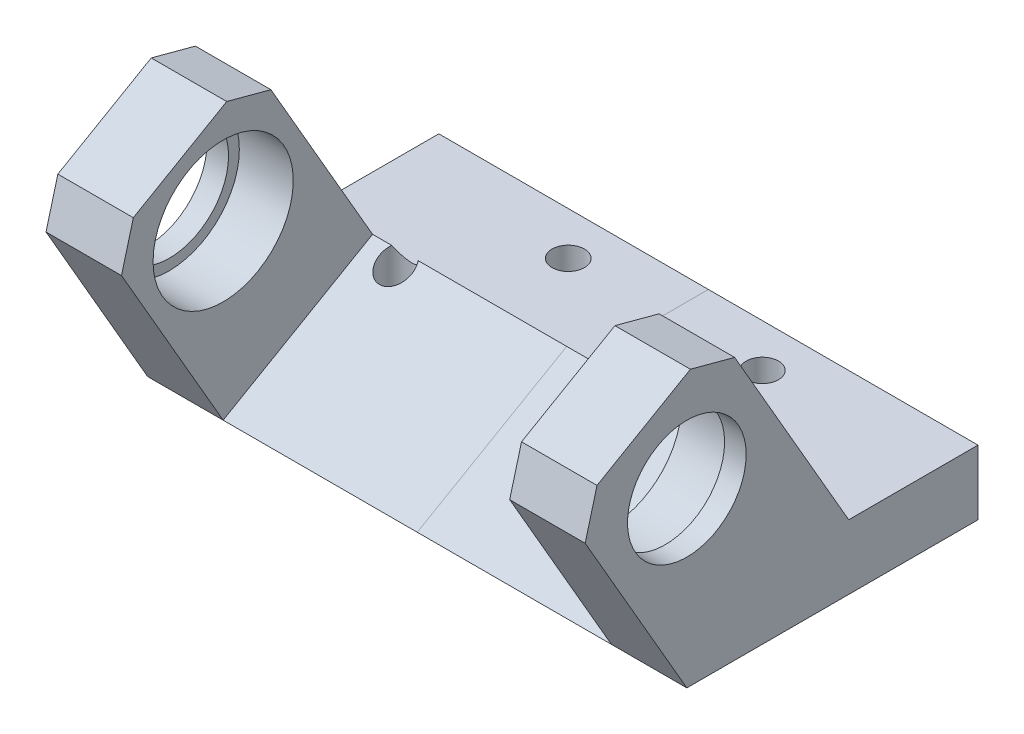
ISO-10303-21;
HEADER;
FILE_DESCRIPTION(('STEP AP214'),'2;1');
FILE_NAME('part.step','',(''),(''),'','','');
FILE_SCHEMA(('AUTOMOTIVE_DESIGN { 1 0 10303 214 1 1 1 1 }'));
ENDSEC;
DATA;
#1=APPLICATION_CONTEXT('core data for automotive mechanical design processes');
#2=APPLICATION_PROTOCOL_DEFINITION('international standard','automotive_design',2000,#1);
#3=PRODUCT_CONTEXT('',#1,'mechanical');
#4=PRODUCT('Part','Part','',(#3));
#5=PRODUCT_RELATED_PRODUCT_CATEGORY('part','',(#4));
#6=PRODUCT_DEFINITION_FORMATION('','',#4);
#7=PRODUCT_DEFINITION_CONTEXT('part definition',#1,'design');
#8=PRODUCT_DEFINITION('design','',#6,#7);
#9=PRODUCT_DEFINITION_SHAPE('','',#8);
#10=(LENGTH_UNIT() NAMED_UNIT(*) SI_UNIT(.MILLI.,.METRE.));
#11=(NAMED_UNIT(*) PLANE_ANGLE_UNIT() SI_UNIT($,.RADIAN.));
#12=(NAMED_UNIT(*) SI_UNIT($,.STERADIAN.) SOLID_ANGLE_UNIT());
#13=UNCERTAINTY_MEASURE_WITH_UNIT(LENGTH_MEASURE(1.E-05),#10,'distance_accuracy_value','');
#14=(GEOMETRIC_REPRESENTATION_CONTEXT(3) GLOBAL_UNCERTAINTY_ASSIGNED_CONTEXT((#13)) GLOBAL_UNIT_ASSIGNED_CONTEXT((#10,
#11,#12)) REPRESENTATION_CONTEXT('',''));
#15=CARTESIAN_POINT('',(0.,0.,0.));
#16=DIRECTION('',(0.,0.,1.));
#17=DIRECTION('',(1.,0.,0.));
#18=AXIS2_PLACEMENT_3D('',#15,#16,#17);
#19=CARTESIAN_POINT('',(0.,0.,0.));
#20=DIRECTION('',(1.,0.,0.));
#21=DIRECTION('',(0.,0.,-1.));
#22=AXIS2_PLACEMENT_3D('',#19,#20,#21);
#23=PLANE('',#22);
#24=DIRECTION('',(0.,0.499999999999999,-0.866025403784439));
#25=VECTOR('',#24,1.);
#26=CARTESIAN_POINT('',(0.,0.,0.));
#27=LINE('',#26,#25);
#28=CARTESIAN_POINT('',(0.,0.,0.));
#29=VERTEX_POINT('',#28);
#30=CARTESIAN_POINT('',(0.,7.99999999999997,-13.856406460551));
#31=VERTEX_POINT('',#30);
#32=EDGE_CURVE('E225',#29,#31,#27,.T.);
#33=ORIENTED_EDGE('',*,*,#32,.F.);
#34=DIRECTION('',(0.,0.,-1.));
#35=VECTOR('',#34,1.);
#36=CARTESIAN_POINT('',(0.,0.,-27.));
#37=LINE('',#36,#35);
#38=CARTESIAN_POINT('',(0.,0.,-27.));
#39=VERTEX_POINT('',#38);
#40=EDGE_CURVE('E227',#29,#39,#37,.T.);
#41=ORIENTED_EDGE('',*,*,#40,.T.);
#42=DIRECTION('',(0.,1.,0.));
#43=VECTOR('',#42,1.);
#44=CARTESIAN_POINT('',(0.,6.,-27.));
#45=LINE('',#44,#43);
#46=CARTESIAN_POINT('',(0.,6.,-27.));
#47=VERTEX_POINT('',#46);
#48=EDGE_CURVE('E167',#39,#47,#45,.T.);
#49=ORIENTED_EDGE('',*,*,#48,.T.);
#50=DIRECTION('',(0.,0.,1.));
#51=VECTOR('',#50,1.);
#52=CARTESIAN_POINT('',(0.,6.,-15.0111069989303));
#53=LINE('',#52,#51);
#54=CARTESIAN_POINT('',(0.,6.,-15.0111069989303));
#55=VERTEX_POINT('',#54);
#56=EDGE_CURVE('E150',#47,#55,#53,.T.);
#57=ORIENTED_EDGE('',*,*,#56,.T.);
#58=DIRECTION('',(0.,0.86602540378444,0.499999999999998));
#59=VECTOR('',#58,1.);
#60=CARTESIAN_POINT('',(0.,26.9282032302755,-2.92820323027557));
#61=LINE('',#60,#59);
#62=EDGE_CURVE('E163',#55,#31,#61,.T.);
#63=ORIENTED_EDGE('',*,*,#62,.T.);
#64=EDGE_LOOP('',(#33,#41,#49,#57,#63));
#65=FACE_BOUND('',#64,.T.);
#66=ADVANCED_FACE('F63',(#65),#23,.T.);
#67=CARTESIAN_POINT('',(-23.,16.,0.));
#68=DIRECTION('',(-1.,0.,0.));
#69=DIRECTION('',(0.,0.,-1.));
#70=AXIS2_PLACEMENT_3D('',#67,#68,#69);
#71=PLANE('',#70);
#72=CARTESIAN_POINT('',(-23.,16.,0.));
#73=DIRECTION('',(1.,0.,0.));
#74=DIRECTION('',(0.,0.,-1.));
#75=AXIS2_PLACEMENT_3D('',#72,#73,#74);
#76=CIRCLE('',#75,6.5);
#77=CARTESIAN_POINT('',(-23.,16.,-6.50000000000004));
#78=VERTEX_POINT('',#77);
#79=EDGE_CURVE('E208',#78,#78,#76,.T.);
#80=ORIENTED_EDGE('',*,*,#79,.T.);
#81=EDGE_LOOP('',(#80));
#82=FACE_BOUND('',#81,.T.);
#83=CARTESIAN_POINT('',(-23.,16.,0.));
#84=DIRECTION('',(1.,0.,0.));
#85=DIRECTION('',(0.,0.,-1.));
#86=AXIS2_PLACEMENT_3D('',#83,#84,#85);
#87=CIRCLE('',#86,5.5);
#88=CARTESIAN_POINT('',(-23.,16.,-5.50000000000004));
#89=VERTEX_POINT('',#88);
#90=EDGE_CURVE('E212',#89,#89,#87,.T.);
#91=ORIENTED_EDGE('',*,*,#90,.F.);
#92=EDGE_LOOP('',(#91));
#93=FACE_BOUND('',#92,.T.);
#94=ADVANCED_FACE('F300',(#82,#93),#71,.F.);
#95=CARTESIAN_POINT('',(-23.,16.,0.));
#96=DIRECTION('',(-1.,0.,0.));
#97=DIRECTION('',(0.,0.,1.));
#98=AXIS2_PLACEMENT_3D('',#95,#96,#97);
#99=CYLINDRICAL_SURFACE('',#98,5.5);
#100=ORIENTED_EDGE('',*,*,#90,.T.);
#101=EDGE_LOOP('',(#100));
#102=FACE_BOUND('',#101,.T.);
#103=CARTESIAN_POINT('',(-25.,16.,0.));
#104=DIRECTION('',(1.,0.,0.));
#105=DIRECTION('',(0.,0.,-1.));
#106=AXIS2_PLACEMENT_3D('',#103,#104,#105);
#107=CIRCLE('',#106,5.5);
#108=CARTESIAN_POINT('',(-25.,16.,-5.50000000000004));
#109=VERTEX_POINT('',#108);
#110=EDGE_CURVE('E213',#109,#109,#107,.T.);
#111=ORIENTED_EDGE('',*,*,#110,.F.);
#112=EDGE_LOOP('',(#111));
#113=FACE_BOUND('',#112,.T.);
#114=ADVANCED_FACE('F302',(#102,#113),#99,.F.);
#115=CARTESIAN_POINT('',(25.,18.9282032302755,10.9282032302755));
#116=DIRECTION('',(0.,-0.86602540378444,-0.499999999999998));
#117=DIRECTION('',(0.,0.499999999999998,-0.86602540378444));
#118=AXIS2_PLACEMENT_3D('',#115,#116,#117);
#119=PLANE('',#118);
#120=DIRECTION('',(1.,0.,0.));
#121=VECTOR('',#120,1.);
#122=CARTESIAN_POINT('',(25.,20.4282032302755,8.33012701892215));
#123=LINE('',#122,#121);
#124=CARTESIAN_POINT('',(-25.,20.4282032302755,8.33012701892215));
#125=VERTEX_POINT('',#124);
#126=CARTESIAN_POINT('',(-18.,20.4282032302755,8.33012701892215));
#127=VERTEX_POINT('',#126);
#128=EDGE_CURVE('E176',#125,#127,#123,.T.);
#129=ORIENTED_EDGE('',*,*,#128,.T.);
#130=DIRECTION('',(0.,-0.499999999999999,0.866025403784439));
#131=VECTOR('',#130,1.);
#132=CARTESIAN_POINT('',(-18.,26.9282032302755,-2.92820323027556));
#133=LINE('',#132,#131);
#134=CARTESIAN_POINT('',(-18.,25.4282032302755,-0.330127018922256));
#135=VERTEX_POINT('',#134);
#136=EDGE_CURVE('E207',#135,#127,#133,.T.);
#137=ORIENTED_EDGE('',*,*,#136,.F.);
#138=DIRECTION('',(-1.,0.,0.));
#139=VECTOR('',#138,1.);
#140=CARTESIAN_POINT('',(25.,25.4282032302755,-0.330127018922264));
#141=LINE('',#140,#139);
#142=CARTESIAN_POINT('',(-25.,25.4282032302755,-0.33012701892226));
#143=VERTEX_POINT('',#142);
#144=EDGE_CURVE('E180',#135,#143,#141,.T.);
#145=ORIENTED_EDGE('',*,*,#144,.T.);
#146=DIRECTION('',(0.,-0.499999999999998,0.86602540378444));
#147=VECTOR('',#146,1.);
#148=CARTESIAN_POINT('',(-25.,18.9282032302755,10.9282032302755));
#149=LINE('',#148,#147);
#150=EDGE_CURVE('E245',#143,#125,#149,.T.);
#151=ORIENTED_EDGE('',*,*,#150,.T.);
#152=EDGE_LOOP('',(#129,#137,#145,#151));
#153=FACE_BOUND('',#152,.T.);
#154=ADVANCED_FACE('F309',(#153),#119,.F.);
#155=CARTESIAN_POINT('',(25.,16.3301270189222,9.42820323027548));
#156=DIRECTION('',(0.,-0.258819045102525,-0.965925826289067));
#157=DIRECTION('',(-1.,0.,0.));
#158=AXIS2_PLACEMENT_3D('',#155,#156,#157);
#159=PLANE('',#158);
#160=DIRECTION('',(0.,0.965925826289067,-0.258819045102525));
#161=VECTOR('',#160,1.);
#162=CARTESIAN_POINT('',(-18.,16.3301270189222,9.42820323027548));
#163=LINE('',#162,#161);
#164=CARTESIAN_POINT('',(-18.,16.3301270189222,9.42820323027548));
#165=VERTEX_POINT('',#164);
#166=EDGE_CURVE('E202',#127,#165,#163,.F.);
#167=ORIENTED_EDGE('',*,*,#166,.F.);
#168=ORIENTED_EDGE('',*,*,#128,.F.);
#169=DIRECTION('',(0.,-0.965925826289067,0.258819045102525));
#170=VECTOR('',#169,1.);
#171=CARTESIAN_POINT('',(-25.,16.3301270189222,9.42820323027548));
#172=LINE('',#171,#170);
#173=CARTESIAN_POINT('',(-25.,16.3301270189222,9.42820323027548));
#174=VERTEX_POINT('',#173);
#175=EDGE_CURVE('E182',#174,#125,#172,.F.);
#176=ORIENTED_EDGE('',*,*,#175,.F.);
#177=DIRECTION('',(-1.,0.,0.));
#178=VECTOR('',#177,1.);
#179=CARTESIAN_POINT('',(25.,16.3301270189222,9.42820323027548));
#180=LINE('',#179,#178);
#181=EDGE_CURVE('E183',#165,#174,#180,.T.);
#182=ORIENTED_EDGE('',*,*,#181,.F.);
#183=EDGE_LOOP('',(#167,#168,#176,#182));
#184=FACE_BOUND('',#183,.T.);
#185=ADVANCED_FACE('F264',(#184),#159,.F.);
#186=CARTESIAN_POINT('',(25.,16.,0.));
#187=DIRECTION('',(-1.,0.,0.));
#188=DIRECTION('',(0.,0.,1.));
#189=AXIS2_PLACEMENT_3D('',#186,#187,#188);
#190=CYLINDRICAL_SURFACE('',#189,6.5);
#191=CARTESIAN_POINT('',(-18.,16.,0.));
#192=DIRECTION('',(-1.,0.,0.));
#193=DIRECTION('',(0.,0.,1.));
#194=AXIS2_PLACEMENT_3D('',#191,#192,#193);
#195=CIRCLE('',#194,6.5);
#196=CARTESIAN_POINT('',(-18.,16.,6.49999999999997));
#197=VERTEX_POINT('',#196);
#198=EDGE_CURVE('E249',#197,#197,#195,.T.);
#199=ORIENTED_EDGE('',*,*,#198,.F.);
#200=EDGE_LOOP('',(#199));
#201=FACE_BOUND('',#200,.T.);
#202=ORIENTED_EDGE('',*,*,#79,.F.);
#203=EDGE_LOOP('',(#202));
#204=FACE_BOUND('',#203,.T.);
#205=ADVANCED_FACE('F315',(#201,#204),#190,.F.);
#206=CARTESIAN_POINT('',(25.,0.,0.));
#207=DIRECTION('',(0.,0.499999999999998,-0.86602540378444));
#208=DIRECTION('',(0.,0.86602540378444,0.499999999999998));
#209=AXIS2_PLACEMENT_3D('',#206,#207,#208);
#210=PLANE('',#209);
#211=DIRECTION('',(-1.,0.,0.));
#212=VECTOR('',#211,1.);
#213=CARTESIAN_POINT('',(25.,0.,0.));
#214=LINE('',#213,#212);
#215=CARTESIAN_POINT('',(-18.,0.,0.));
#216=VERTEX_POINT('',#215);
#217=CARTESIAN_POINT('',(-25.,0.,0.));
#218=VERTEX_POINT('',#217);
#219=EDGE_CURVE('E157',#216,#218,#214,.T.);
#220=ORIENTED_EDGE('',*,*,#219,.F.);
#221=DIRECTION('',(0.,0.86602540378444,0.499999999999998));
#222=VECTOR('',#221,1.);
#223=CARTESIAN_POINT('',(-18.,0.,0.));
#224=LINE('',#223,#222);
#225=EDGE_CURVE('E196',#216,#165,#224,.T.);
#226=ORIENTED_EDGE('',*,*,#225,.T.);
#227=ORIENTED_EDGE('',*,*,#181,.T.);
#228=DIRECTION('',(0.,-0.86602540378444,-0.499999999999998));
#229=VECTOR('',#228,1.);
#230=CARTESIAN_POINT('',(-25.,0.,0.));
#231=LINE('',#230,#229);
#232=EDGE_CURVE('E189',#174,#218,#231,.T.);
#233=ORIENTED_EDGE('',*,*,#232,.T.);
#234=EDGE_LOOP('',(#220,#226,#227,#233));
#235=FACE_BOUND('',#234,.T.);
#236=ADVANCED_FACE('F261',(#235),#210,.F.);
#237=CARTESIAN_POINT('',(25.,6.,-27.));
#238=DIRECTION('',(0.,0.,1.));
#239=DIRECTION('',(1.,0.,0.));
#240=AXIS2_PLACEMENT_3D('',#237,#238,#239);
#241=PLANE('',#240);
#242=ORIENTED_EDGE('',*,*,#48,.F.);
#243=DIRECTION('',(-1.,0.,0.));
#244=VECTOR('',#243,1.);
#245=CARTESIAN_POINT('',(25.,0.,-27.));
#246=LINE('',#245,#244);
#247=CARTESIAN_POINT('',(-25.,0.,-27.));
#248=VERTEX_POINT('',#247);
#249=EDGE_CURVE('E185',#39,#248,#246,.T.);
#250=ORIENTED_EDGE('',*,*,#249,.T.);
#251=DIRECTION('',(0.,1.,0.));
#252=VECTOR('',#251,1.);
#253=CARTESIAN_POINT('',(-25.,6.,-27.));
#254=LINE('',#253,#252);
#255=CARTESIAN_POINT('',(-25.,6.,-27.));
#256=VERTEX_POINT('',#255);
#257=EDGE_CURVE('E234',#248,#256,#254,.T.);
#258=ORIENTED_EDGE('',*,*,#257,.T.);
#259=DIRECTION('',(-1.,0.,0.));
#260=VECTOR('',#259,1.);
#261=CARTESIAN_POINT('',(25.,6.,-27.));
#262=LINE('',#261,#260);
#263=EDGE_CURVE('E158',#47,#256,#262,.T.);
#264=ORIENTED_EDGE('',*,*,#263,.F.);
#265=EDGE_LOOP('',(#242,#250,#258,#264));
#266=FACE_BOUND('',#265,.T.);
#267=ADVANCED_FACE('F231',(#266),#241,.F.);
#268=CARTESIAN_POINT('',(-9.,0.,-23.));
#269=DIRECTION('',(0.,-1.,0.));
#270=DIRECTION('',(0.,0.,-1.));
#271=AXIS2_PLACEMENT_3D('',#268,#269,#270);
#272=CYLINDRICAL_SURFACE('',#271,1.49999999999999);
#273=CARTESIAN_POINT('',(-9.,0.,-23.));
#274=DIRECTION('',(0.,-1.,0.));
#275=DIRECTION('',(0.,0.,-1.));
#276=AXIS2_PLACEMENT_3D('',#273,#274,#275);
#277=CIRCLE('',#276,1.49999999999999);
#278=CARTESIAN_POINT('',(-9.,0.,-24.5));
#279=VERTEX_POINT('',#278);
#280=EDGE_CURVE('E15',#279,#279,#277,.T.);
#281=ORIENTED_EDGE('',*,*,#280,.T.);
#282=EDGE_LOOP('',(#281));
#283=FACE_BOUND('',#282,.T.);
#284=CARTESIAN_POINT('',(-9.,6.,-23.));
#285=DIRECTION('',(0.,-1.,0.));
#286=DIRECTION('',(0.,0.,-1.));
#287=AXIS2_PLACEMENT_3D('',#284,#285,#286);
#288=CIRCLE('',#287,1.49999999999999);
#289=CARTESIAN_POINT('',(-9.,6.,-24.5));
#290=VERTEX_POINT('',#289);
#291=EDGE_CURVE('E72',#290,#290,#288,.T.);
#292=ORIENTED_EDGE('',*,*,#291,.F.);
#293=EDGE_LOOP('',(#292));
#294=FACE_BOUND('',#293,.T.);
#295=ADVANCED_FACE('F284',(#283,#294),#272,.F.);
#296=CARTESIAN_POINT('',(25.,25.4282032302755,-0.330127018922264));
#297=DIRECTION('',(0.,-0.965925826289067,0.258819045102525));
#298=DIRECTION('',(-1.,0.,0.));
#299=AXIS2_PLACEMENT_3D('',#296,#297,#298);
#300=PLANE('',#299);
#301=DIRECTION('',(0.,-0.258819045102525,-0.965925826289067));
#302=VECTOR('',#301,1.);
#303=CARTESIAN_POINT('',(-18.,25.4282032302755,-0.330127018922264));
#304=LINE('',#303,#302);
#305=CARTESIAN_POINT('',(-18.,24.3301270189222,-4.42820323027556));
#306=VERTEX_POINT('',#305);
#307=EDGE_CURVE('E177',#306,#135,#304,.F.);
#308=ORIENTED_EDGE('',*,*,#307,.F.);
#309=DIRECTION('',(1.,0.,0.));
#310=VECTOR('',#309,1.);
#311=CARTESIAN_POINT('',(25.,24.3301270189222,-4.42820323027556));
#312=LINE('',#311,#310);
#313=CARTESIAN_POINT('',(-25.,24.3301270189222,-4.42820323027556));
#314=VERTEX_POINT('',#313);
#315=EDGE_CURVE('E173',#314,#306,#312,.T.);
#316=ORIENTED_EDGE('',*,*,#315,.F.);
#317=DIRECTION('',(0.,0.258819045102525,0.965925826289067));
#318=VECTOR('',#317,1.);
#319=CARTESIAN_POINT('',(-25.,25.4282032302755,-0.330127018922264));
#320=LINE('',#319,#318);
#321=EDGE_CURVE('E186',#143,#314,#320,.F.);
#322=ORIENTED_EDGE('',*,*,#321,.F.);
#323=ORIENTED_EDGE('',*,*,#144,.F.);
#324=EDGE_LOOP('',(#308,#316,#322,#323));
#325=FACE_BOUND('',#324,.T.);
#326=ADVANCED_FACE('F287',(#325),#300,.F.);
#327=CARTESIAN_POINT('',(-25.,0.,0.));
#328=DIRECTION('',(1.,0.,0.));
#329=DIRECTION('',(0.,0.,-1.));
#330=AXIS2_PLACEMENT_3D('',#327,#328,#329);
#331=PLANE('',#330);
#332=ORIENTED_EDGE('',*,*,#232,.F.);
#333=ORIENTED_EDGE('',*,*,#175,.T.);
#334=ORIENTED_EDGE('',*,*,#150,.F.);
#335=ORIENTED_EDGE('',*,*,#321,.T.);
#336=DIRECTION('',(0.,0.86602540378444,0.499999999999998));
#337=VECTOR('',#336,1.);
#338=CARTESIAN_POINT('',(-25.,26.9282032302755,-2.92820323027557));
#339=LINE('',#338,#337);
#340=CARTESIAN_POINT('',(-25.,6.,-15.0111069989303));
#341=VERTEX_POINT('',#340);
#342=EDGE_CURVE('E243',#341,#314,#339,.T.);
#343=ORIENTED_EDGE('',*,*,#342,.F.);
#344=DIRECTION('',(0.,0.,1.));
#345=VECTOR('',#344,1.);
#346=CARTESIAN_POINT('',(-25.,6.,-15.0111069989303));
#347=LINE('',#346,#345);
#348=EDGE_CURVE('E152',#256,#341,#347,.T.);
#349=ORIENTED_EDGE('',*,*,#348,.F.);
#350=ORIENTED_EDGE('',*,*,#257,.F.);
#351=DIRECTION('',(0.,0.,-1.));
#352=VECTOR('',#351,1.);
#353=CARTESIAN_POINT('',(-25.,0.,-27.));
#354=LINE('',#353,#352);
#355=EDGE_CURVE('E238',#218,#248,#354,.T.);
#356=ORIENTED_EDGE('',*,*,#355,.F.);
#357=EDGE_LOOP('',(#332,#333,#334,#335,#343,#349,#350,#356));
#358=FACE_BOUND('',#357,.T.);
#359=ORIENTED_EDGE('',*,*,#110,.T.);
#360=EDGE_LOOP('',(#359));
#361=FACE_BOUND('',#360,.T.);
#362=ADVANCED_FACE('F241',(#358,#361),#331,.F.);
#363=CARTESIAN_POINT('',(25.,6.,-15.0111069989303));
#364=DIRECTION('',(0.,-1.,0.));
#365=DIRECTION('',(0.,0.,-1.));
#366=AXIS2_PLACEMENT_3D('',#363,#364,#365);
#367=PLANE('',#366);
#368=ORIENTED_EDGE('',*,*,#291,.T.);
#369=EDGE_LOOP('',(#368));
#370=FACE_BOUND('',#369,.T.);
#371=ORIENTED_EDGE('',*,*,#56,.F.);
#372=ORIENTED_EDGE('',*,*,#263,.T.);
#373=ORIENTED_EDGE('',*,*,#348,.T.);
#374=DIRECTION('',(-1.,0.,0.));
#375=VECTOR('',#374,1.);
#376=CARTESIAN_POINT('',(25.,6.,-15.0111069989303));
#377=LINE('',#376,#375);
#378=EDGE_CURVE('E147',#55,#341,#377,.T.);
#379=ORIENTED_EDGE('',*,*,#378,.F.);
#380=EDGE_LOOP('',(#371,#372,#373,#379));
#381=FACE_BOUND('',#380,.T.);
#382=ADVANCED_FACE('F149',(#370,#381),#367,.F.);
#383=CARTESIAN_POINT('',(-18.,7.99999999999997,-13.856406460551));
#384=DIRECTION('',(-1.,0.,0.));
#385=DIRECTION('',(0.,0.,1.));
#386=AXIS2_PLACEMENT_3D('',#383,#384,#385);
#387=PLANE('',#386);
#388=ORIENTED_EDGE('',*,*,#198,.T.);
#389=EDGE_LOOP('',(#388));
#390=FACE_BOUND('',#389,.T.);
#391=ORIENTED_EDGE('',*,*,#166,.T.);
#392=ORIENTED_EDGE('',*,*,#225,.F.);
#393=DIRECTION('',(0.,-0.499999999999999,0.866025403784439));
#394=VECTOR('',#393,1.);
#395=CARTESIAN_POINT('',(-18.,7.99999999999997,-13.856406460551));
#396=LINE('',#395,#394);
#397=CARTESIAN_POINT('',(-18.,7.99999999999997,-13.856406460551));
#398=VERTEX_POINT('',#397);
#399=EDGE_CURVE('E192',#398,#216,#396,.T.);
#400=ORIENTED_EDGE('',*,*,#399,.F.);
#401=DIRECTION('',(0.,0.86602540378444,0.499999999999998));
#402=VECTOR('',#401,1.);
#403=CARTESIAN_POINT('',(-18.,7.99999999999997,-13.856406460551));
#404=LINE('',#403,#402);
#405=EDGE_CURVE('E193',#398,#306,#404,.T.);
#406=ORIENTED_EDGE('',*,*,#405,.T.);
#407=ORIENTED_EDGE('',*,*,#307,.T.);
#408=ORIENTED_EDGE('',*,*,#136,.T.);
#409=EDGE_LOOP('',(#391,#392,#400,#406,#407,#408));
#410=FACE_BOUND('',#409,.T.);
#411=ADVANCED_FACE('F254',(#390,#410),#387,.F.);
#412=CARTESIAN_POINT('',(-15.,0.,-13.));
#413=DIRECTION('',(0.,-1.,0.));
#414=DIRECTION('',(0.,0.,-1.));
#415=AXIS2_PLACEMENT_3D('',#412,#413,#414);
#416=CYLINDRICAL_SURFACE('',#415,1.49999999999999);
#417=CARTESIAN_POINT('',(-15.,7.50555349946509,-13.));
#418=DIRECTION('',(0.,0.866025403784439,0.499999999999999));
#419=DIRECTION('',(0.,-0.499999999999999,0.866025403784439));
#420=AXIS2_PLACEMENT_3D('',#417,#418,#419);
#421=ELLIPSE('',#420,1.73205080756886,1.49999999999999);
#422=CARTESIAN_POINT('',(-16.2314901438202,7.99999999999997,-13.856406460551));
#423=VERTEX_POINT('',#422);
#424=CARTESIAN_POINT('',(-13.7685098561798,7.99999999999997,-13.856406460551));
#425=VERTEX_POINT('',#424);
#426=EDGE_CURVE('E216',#423,#425,#421,.T.);
#427=ORIENTED_EDGE('',*,*,#426,.T.);
#428=CARTESIAN_POINT('',(-15.,9.48333950160461,-13.));
#429=DIRECTION('',(0.,-0.499999999999998,0.86602540378444));
#430=DIRECTION('',(0.,-0.86602540378444,-0.499999999999998));
#431=AXIS2_PLACEMENT_3D('',#428,#429,#430);
#432=ELLIPSE('',#431,2.99999999999999,1.49999999999999);
#433=EDGE_CURVE('E79',#423,#425,#432,.T.);
#434=ORIENTED_EDGE('',*,*,#433,.F.);
#435=EDGE_LOOP('',(#427,#434));
#436=FACE_BOUND('',#435,.T.);
#437=CARTESIAN_POINT('',(-15.,0.,-13.));
#438=DIRECTION('',(0.,-1.,0.));
#439=DIRECTION('',(0.,0.,-1.));
#440=AXIS2_PLACEMENT_3D('',#437,#438,#439);
#441=CIRCLE('',#440,1.49999999999999);
#442=CARTESIAN_POINT('',(-15.,0.,-14.5));
#443=VERTEX_POINT('',#442);
#444=EDGE_CURVE('E220',#443,#443,#441,.T.);
#445=ORIENTED_EDGE('',*,*,#444,.T.);
#446=EDGE_LOOP('',(#445));
#447=FACE_BOUND('',#446,.T.);
#448=ADVANCED_FACE('F272',(#436,#447),#416,.F.);
#449=CARTESIAN_POINT('',(25.,26.9282032302755,-2.92820323027557));
#450=DIRECTION('',(0.,-0.499999999999998,0.86602540378444));
#451=DIRECTION('',(0.,-0.86602540378444,-0.499999999999998));
#452=AXIS2_PLACEMENT_3D('',#449,#450,#451);
#453=PLANE('',#452);
#454=ORIENTED_EDGE('',*,*,#62,.F.);
#455=ORIENTED_EDGE('',*,*,#378,.T.);
#456=ORIENTED_EDGE('',*,*,#342,.T.);
#457=ORIENTED_EDGE('',*,*,#315,.T.);
#458=ORIENTED_EDGE('',*,*,#405,.F.);
#459=DIRECTION('',(-1.,0.,0.));
#460=VECTOR('',#459,1.);
#461=CARTESIAN_POINT('',(-18.,7.99999999999997,-13.856406460551));
#462=LINE('',#461,#460);
#463=EDGE_CURVE('E86',#423,#398,#462,.T.);
#464=ORIENTED_EDGE('',*,*,#463,.F.);
#465=ORIENTED_EDGE('',*,*,#433,.T.);
#466=EDGE_CURVE('E67',#31,#425,#462,.T.);
#467=ORIENTED_EDGE('',*,*,#466,.F.);
#468=EDGE_LOOP('',(#454,#455,#456,#457,#458,#464,#465,#467));
#469=FACE_BOUND('',#468,.T.);
#470=ADVANCED_FACE('F169',(#469),#453,.F.);
#471=CARTESIAN_POINT('',(25.,0.,-27.));
#472=DIRECTION('',(0.,1.,0.));
#473=DIRECTION('',(0.,0.,1.));
#474=AXIS2_PLACEMENT_3D('',#471,#472,#473);
#475=PLANE('',#474);
#476=ORIENTED_EDGE('',*,*,#444,.F.);
#477=EDGE_LOOP('',(#476));
#478=FACE_BOUND('',#477,.T.);
#479=ORIENTED_EDGE('',*,*,#280,.F.);
#480=EDGE_LOOP('',(#479));
#481=FACE_BOUND('',#480,.T.);
#482=ORIENTED_EDGE('',*,*,#40,.F.);
#483=DIRECTION('',(1.,0.,0.));
#484=VECTOR('',#483,1.);
#485=CARTESIAN_POINT('',(-18.,0.,0.));
#486=LINE('',#485,#484);
#487=EDGE_CURVE('E190',#216,#29,#486,.T.);
#488=ORIENTED_EDGE('',*,*,#487,.F.);
#489=ORIENTED_EDGE('',*,*,#219,.T.);
#490=ORIENTED_EDGE('',*,*,#355,.T.);
#491=ORIENTED_EDGE('',*,*,#249,.F.);
#492=EDGE_LOOP('',(#482,#488,#489,#490,#491));
#493=FACE_BOUND('',#492,.T.);
#494=ADVANCED_FACE('F278',(#478,#481,#493),#475,.F.);
#495=CARTESIAN_POINT('',(0.,0.,0.));
#496=DIRECTION('',(0.,0.866025403784439,0.499999999999999));
#497=DIRECTION('',(0.,-0.499999999999999,0.866025403784439));
#498=AXIS2_PLACEMENT_3D('',#495,#496,#497);
#499=PLANE('',#498);
#500=ORIENTED_EDGE('',*,*,#487,.T.);
#501=ORIENTED_EDGE('',*,*,#32,.T.);
#502=ORIENTED_EDGE('',*,*,#466,.T.);
#503=ORIENTED_EDGE('',*,*,#426,.F.);
#504=ORIENTED_EDGE('',*,*,#463,.T.);
#505=ORIENTED_EDGE('',*,*,#399,.T.);
#506=EDGE_LOOP('',(#500,#501,#502,#503,#504,#505));
#507=FACE_BOUND('',#506,.T.);
#508=ADVANCED_FACE('F65',(#507),#499,.T.);
#509=CLOSED_SHELL('',(#66,#94,#114,#154,#185,#205,#236,#267,#295,#326,#362,#382,#411,#448,#470,
#494,#508));
#510=MANIFOLD_SOLID_BREP('B2',#509);
#511=CARTESIAN_POINT('',(0.,0.,0.));
#512=DIRECTION('',(1.,0.,0.));
#513=DIRECTION('',(0.,0.,-1.));
#514=AXIS2_PLACEMENT_3D('',#511,#512,#513);
#515=PLANE('',#514);
#516=DIRECTION('',(0.,0.499999999999999,-0.866025403784439));
#517=VECTOR('',#516,1.);
#518=CARTESIAN_POINT('',(0.,0.,0.));
#519=LINE('',#518,#517);
#520=CARTESIAN_POINT('',(0.,0.,0.));
#521=VERTEX_POINT('',#520);
#522=CARTESIAN_POINT('',(0.,7.99999999999997,-13.856406460551));
#523=VERTEX_POINT('',#522);
#524=EDGE_CURVE('E61',#521,#523,#519,.T.);
#525=ORIENTED_EDGE('',*,*,#524,.T.);
#526=DIRECTION('',(0.,0.86602540378444,0.499999999999998));
#527=VECTOR('',#526,1.);
#528=CARTESIAN_POINT('',(0.,26.9282032302755,-2.92820323027557));
#529=LINE('',#528,#527);
#530=CARTESIAN_POINT('',(0.,6.,-15.0111069989303));
#531=VERTEX_POINT('',#530);
#532=EDGE_CURVE('E493',#531,#523,#529,.T.);
#533=ORIENTED_EDGE('',*,*,#532,.F.);
#534=DIRECTION('',(0.,0.,1.));
#535=VECTOR('',#534,1.);
#536=CARTESIAN_POINT('',(0.,6.,-15.0111069989303));
#537=LINE('',#536,#535);
#538=CARTESIAN_POINT('',(0.,6.,-27.));
#539=VERTEX_POINT('',#538);
#540=EDGE_CURVE('E638',#539,#531,#537,.T.);
#541=ORIENTED_EDGE('',*,*,#540,.F.);
#542=DIRECTION('',(0.,1.,0.));
#543=VECTOR('',#542,1.);
#544=CARTESIAN_POINT('',(0.,6.,-27.));
#545=LINE('',#544,#543);
#546=CARTESIAN_POINT('',(0.,0.,-27.));
#547=VERTEX_POINT('',#546);
#548=EDGE_CURVE('E639',#547,#539,#545,.T.);
#549=ORIENTED_EDGE('',*,*,#548,.F.);
#550=DIRECTION('',(0.,0.,-1.));
#551=VECTOR('',#550,1.);
#552=CARTESIAN_POINT('',(0.,0.,-27.));
#553=LINE('',#552,#551);
#554=EDGE_CURVE('E481',#521,#547,#553,.T.);
#555=ORIENTED_EDGE('',*,*,#554,.F.);
#556=EDGE_LOOP('',(#525,#533,#541,#549,#555));
#557=FACE_BOUND('',#556,.T.);
#558=ADVANCED_FACE('F478',(#557),#515,.F.);
#559=CARTESIAN_POINT('',(25.,16.,0.));
#560=DIRECTION('',(-1.,0.,0.));
#561=DIRECTION('',(0.,0.,1.));
#562=AXIS2_PLACEMENT_3D('',#559,#560,#561);
#563=CYLINDRICAL_SURFACE('',#562,6.5);
#564=CARTESIAN_POINT('',(18.,16.,0.));
#565=DIRECTION('',(1.,0.,0.));
#566=DIRECTION('',(0.,0.,-1.));
#567=AXIS2_PLACEMENT_3D('',#564,#565,#566);
#568=CIRCLE('',#567,6.5);
#569=CARTESIAN_POINT('',(18.,16.,-6.50000000000004));
#570=VERTEX_POINT('',#569);
#571=EDGE_CURVE('E593',#570,#570,#568,.T.);
#572=ORIENTED_EDGE('',*,*,#571,.F.);
#573=EDGE_LOOP('',(#572));
#574=FACE_BOUND('',#573,.T.);
#575=CARTESIAN_POINT('',(23.,16.,0.));
#576=DIRECTION('',(1.,0.,0.));
#577=DIRECTION('',(0.,0.,-1.));
#578=AXIS2_PLACEMENT_3D('',#575,#576,#577);
#579=CIRCLE('',#578,6.5);
#580=CARTESIAN_POINT('',(23.,16.,-6.50000000000004));
#581=VERTEX_POINT('',#580);
#582=EDGE_CURVE('E586',#581,#581,#579,.T.);
#583=ORIENTED_EDGE('',*,*,#582,.T.);
#584=EDGE_LOOP('',(#583));
#585=FACE_BOUND('',#584,.T.);
#586=ADVANCED_FACE('F692',(#574,#585),#563,.F.);
#587=CARTESIAN_POINT('',(25.,18.9282032302755,10.9282032302755));
#588=DIRECTION('',(0.,-0.86602540378444,-0.499999999999998));
#589=DIRECTION('',(0.,0.499999999999998,-0.86602540378444));
#590=AXIS2_PLACEMENT_3D('',#587,#588,#589);
#591=PLANE('',#590);
#592=DIRECTION('',(-1.,0.,0.));
#593=VECTOR('',#592,1.);
#594=CARTESIAN_POINT('',(25.,25.4282032302755,-0.330127018922264));
#595=LINE('',#594,#593);
#596=CARTESIAN_POINT('',(25.,25.4282032302755,-0.330127018922254));
#597=VERTEX_POINT('',#596);
#598=CARTESIAN_POINT('',(18.,25.4282032302755,-0.330127018922256));
#599=VERTEX_POINT('',#598);
#600=EDGE_CURVE('E625',#597,#599,#595,.T.);
#601=ORIENTED_EDGE('',*,*,#600,.T.);
#602=DIRECTION('',(0.,0.499999999999999,-0.866025403784439));
#603=VECTOR('',#602,1.);
#604=CARTESIAN_POINT('',(18.,26.9282032302755,-2.92820323027556));
#605=LINE('',#604,#603);
#606=CARTESIAN_POINT('',(18.,20.4282032302755,8.33012701892215));
#607=VERTEX_POINT('',#606);
#608=EDGE_CURVE('E579',#607,#599,#605,.T.);
#609=ORIENTED_EDGE('',*,*,#608,.F.);
#610=DIRECTION('',(1.,0.,0.));
#611=VECTOR('',#610,1.);
#612=CARTESIAN_POINT('',(25.,20.4282032302755,8.33012701892215));
#613=LINE('',#612,#611);
#614=CARTESIAN_POINT('',(25.,20.4282032302755,8.33012701892215));
#615=VERTEX_POINT('',#614);
#616=EDGE_CURVE('E628',#607,#615,#613,.T.);
#617=ORIENTED_EDGE('',*,*,#616,.T.);
#618=DIRECTION('',(0.,-0.499999999999998,0.86602540378444));
#619=VECTOR('',#618,1.);
#620=CARTESIAN_POINT('',(25.,18.9282032302755,10.9282032302755));
#621=LINE('',#620,#619);
#622=EDGE_CURVE('E606',#597,#615,#621,.T.);
#623=ORIENTED_EDGE('',*,*,#622,.F.);
#624=EDGE_LOOP('',(#601,#609,#617,#623));
#625=FACE_BOUND('',#624,.T.);
#626=ADVANCED_FACE('F670',(#625),#591,.F.);
#627=CARTESIAN_POINT('',(25.,0.,0.));
#628=DIRECTION('',(0.,0.499999999999998,-0.86602540378444));
#629=DIRECTION('',(0.,0.86602540378444,0.499999999999998));
#630=AXIS2_PLACEMENT_3D('',#627,#628,#629);
#631=PLANE('',#630);
#632=DIRECTION('',(-1.,0.,0.));
#633=VECTOR('',#632,1.);
#634=CARTESIAN_POINT('',(25.,16.3301270189222,9.42820323027548));
#635=LINE('',#634,#633);
#636=CARTESIAN_POINT('',(25.,16.3301270189222,9.42820323027548));
#637=VERTEX_POINT('',#636);
#638=CARTESIAN_POINT('',(18.,16.3301270189222,9.42820323027548));
#639=VERTEX_POINT('',#638);
#640=EDGE_CURVE('E622',#637,#639,#635,.T.);
#641=ORIENTED_EDGE('',*,*,#640,.T.);
#642=DIRECTION('',(0.,0.86602540378444,0.499999999999998));
#643=VECTOR('',#642,1.);
#644=CARTESIAN_POINT('',(18.,0.,0.));
#645=LINE('',#644,#643);
#646=CARTESIAN_POINT('',(18.,0.,0.));
#647=VERTEX_POINT('',#646);
#648=EDGE_CURVE('E587',#647,#639,#645,.T.);
#649=ORIENTED_EDGE('',*,*,#648,.F.);
#650=DIRECTION('',(-1.,0.,0.));
#651=VECTOR('',#650,1.);
#652=CARTESIAN_POINT('',(25.,0.,0.));
#653=LINE('',#652,#651);
#654=CARTESIAN_POINT('',(25.,0.,0.));
#655=VERTEX_POINT('',#654);
#656=EDGE_CURVE('E611',#655,#647,#653,.T.);
#657=ORIENTED_EDGE('',*,*,#656,.F.);
#658=DIRECTION('',(0.,-0.86602540378444,-0.499999999999998));
#659=VECTOR('',#658,1.);
#660=CARTESIAN_POINT('',(25.,0.,0.));
#661=LINE('',#660,#659);
#662=EDGE_CURVE('E609',#637,#655,#661,.T.);
#663=ORIENTED_EDGE('',*,*,#662,.F.);
#664=EDGE_LOOP('',(#641,#649,#657,#663));
#665=FACE_BOUND('',#664,.T.);
#666=ADVANCED_FACE('F657',(#665),#631,.F.);
#667=CARTESIAN_POINT('',(25.,16.3301270189222,9.42820323027548));
#668=DIRECTION('',(0.,-0.258819045102525,-0.965925826289067));
#669=DIRECTION('',(-1.,0.,0.));
#670=AXIS2_PLACEMENT_3D('',#667,#668,#669);
#671=PLANE('',#670);
#672=DIRECTION('',(0.,-0.965925826289067,0.258819045102525));
#673=VECTOR('',#672,1.);
#674=CARTESIAN_POINT('',(18.,16.3301270189222,9.42820323027548));
#675=LINE('',#674,#673);
#676=EDGE_CURVE('E589',#639,#607,#675,.F.);
#677=ORIENTED_EDGE('',*,*,#676,.F.);
#678=ORIENTED_EDGE('',*,*,#640,.F.);
#679=DIRECTION('',(0.,0.965925826289067,-0.258819045102525));
#680=VECTOR('',#679,1.);
#681=CARTESIAN_POINT('',(25.,3.45096189432341,12.8791651245989));
#682=LINE('',#681,#680);
#683=EDGE_CURVE('E632',#615,#637,#682,.F.);
#684=ORIENTED_EDGE('',*,*,#683,.F.);
#685=ORIENTED_EDGE('',*,*,#616,.F.);
#686=EDGE_LOOP('',(#677,#678,#684,#685));
#687=FACE_BOUND('',#686,.T.);
#688=ADVANCED_FACE('F666',(#687),#671,.F.);
#689=CARTESIAN_POINT('',(25.,25.4282032302755,-0.330127018922264));
#690=DIRECTION('',(0.,-0.965925826289067,0.258819045102525));
#691=DIRECTION('',(-1.,0.,0.));
#692=AXIS2_PLACEMENT_3D('',#689,#690,#691);
#693=PLANE('',#692);
#694=DIRECTION('',(0.,0.258819045102525,0.965925826289067));
#695=VECTOR('',#694,1.);
#696=CARTESIAN_POINT('',(18.,25.4282032302755,-0.330127018922264));
#697=LINE('',#696,#695);
#698=CARTESIAN_POINT('',(18.,24.3301270189222,-4.42820323027556));
#699=VERTEX_POINT('',#698);
#700=EDGE_CURVE('E564',#599,#699,#697,.F.);
#701=ORIENTED_EDGE('',*,*,#700,.F.);
#702=ORIENTED_EDGE('',*,*,#600,.F.);
#703=DIRECTION('',(0.,-0.258819045102525,-0.965925826289067));
#704=VECTOR('',#703,1.);
#705=CARTESIAN_POINT('',(25.,23.8073683548743,-6.37916512459895));
#706=LINE('',#705,#704);
#707=CARTESIAN_POINT('',(25.,24.3301270189222,-4.42820323027556));
#708=VERTEX_POINT('',#707);
#709=EDGE_CURVE('E630',#708,#597,#706,.F.);
#710=ORIENTED_EDGE('',*,*,#709,.F.);
#711=DIRECTION('',(1.,0.,0.));
#712=VECTOR('',#711,1.);
#713=CARTESIAN_POINT('',(25.,24.3301270189222,-4.42820323027556));
#714=LINE('',#713,#712);
#715=EDGE_CURVE('E634',#699,#708,#714,.T.);
#716=ORIENTED_EDGE('',*,*,#715,.F.);
#717=EDGE_LOOP('',(#701,#702,#710,#716));
#718=FACE_BOUND('',#717,.T.);
#719=ADVANCED_FACE('F677',(#718),#693,.F.);
#720=CARTESIAN_POINT('',(25.,0.,0.));
#721=DIRECTION('',(1.,0.,0.));
#722=DIRECTION('',(0.,0.,-1.));
#723=AXIS2_PLACEMENT_3D('',#720,#721,#722);
#724=PLANE('',#723);
#725=ORIENTED_EDGE('',*,*,#622,.T.);
#726=ORIENTED_EDGE('',*,*,#683,.T.);
#727=ORIENTED_EDGE('',*,*,#662,.T.);
#728=DIRECTION('',(0.,0.,-1.));
#729=VECTOR('',#728,1.);
#730=CARTESIAN_POINT('',(25.,0.,-27.));
#731=LINE('',#730,#729);
#732=CARTESIAN_POINT('',(25.,0.,-27.));
#733=VERTEX_POINT('',#732);
#734=EDGE_CURVE('E596',#655,#733,#731,.T.);
#735=ORIENTED_EDGE('',*,*,#734,.T.);
#736=DIRECTION('',(0.,1.,0.));
#737=VECTOR('',#736,1.);
#738=CARTESIAN_POINT('',(25.,6.,-27.));
#739=LINE('',#738,#737);
#740=CARTESIAN_POINT('',(25.,6.,-27.));
#741=VERTEX_POINT('',#740);
#742=EDGE_CURVE('E599',#733,#741,#739,.T.);
#743=ORIENTED_EDGE('',*,*,#742,.T.);
#744=DIRECTION('',(0.,0.,1.));
#745=VECTOR('',#744,1.);
#746=CARTESIAN_POINT('',(25.,6.,-15.0111069989303));
#747=LINE('',#746,#745);
#748=CARTESIAN_POINT('',(25.,6.,-15.0111069989303));
#749=VERTEX_POINT('',#748);
#750=EDGE_CURVE('E601',#741,#749,#747,.T.);
#751=ORIENTED_EDGE('',*,*,#750,.T.);
#752=DIRECTION('',(0.,0.86602540378444,0.499999999999998));
#753=VECTOR('',#752,1.);
#754=CARTESIAN_POINT('',(25.,26.9282032302755,-2.92820323027557));
#755=LINE('',#754,#753);
#756=EDGE_CURVE('E603',#749,#708,#755,.T.);
#757=ORIENTED_EDGE('',*,*,#756,.T.);
#758=ORIENTED_EDGE('',*,*,#709,.T.);
#759=EDGE_LOOP('',(#725,#726,#727,#735,#743,#751,#757,#758));
#760=FACE_BOUND('',#759,.T.);
#761=CARTESIAN_POINT('',(25.,16.,0.));
#762=DIRECTION('',(1.,0.,0.));
#763=DIRECTION('',(0.,0.,-1.));
#764=AXIS2_PLACEMENT_3D('',#761,#762,#763);
#765=CIRCLE('',#764,5.5);
#766=CARTESIAN_POINT('',(25.,16.,-5.50000000000004));
#767=VERTEX_POINT('',#766);
#768=EDGE_CURVE('E867',#767,#767,#765,.T.);
#769=ORIENTED_EDGE('',*,*,#768,.F.);
#770=EDGE_LOOP('',(#769));
#771=FACE_BOUND('',#770,.T.);
#772=ADVANCED_FACE('F651',(#760,#771),#724,.T.);
#773=CARTESIAN_POINT('',(25.,0.,-27.));
#774=DIRECTION('',(0.,1.,0.));
#775=DIRECTION('',(0.,0.,1.));
#776=AXIS2_PLACEMENT_3D('',#773,#774,#775);
#777=PLANE('',#776);
#778=CARTESIAN_POINT('',(15.,0.,-13.));
#779=DIRECTION('',(0.,-1.,0.));
#780=DIRECTION('',(0.,0.,-1.));
#781=AXIS2_PLACEMENT_3D('',#778,#779,#780);
#782=CIRCLE('',#781,1.49999999999999);
#783=CARTESIAN_POINT('',(15.,0.,-14.5));
#784=VERTEX_POINT('',#783);
#785=EDGE_CURVE('E573',#784,#784,#782,.T.);
#786=ORIENTED_EDGE('',*,*,#785,.F.);
#787=EDGE_LOOP('',(#786));
#788=FACE_BOUND('',#787,.T.);
#789=CARTESIAN_POINT('',(9.,0.,-23.));
#790=DIRECTION('',(0.,-1.,0.));
#791=DIRECTION('',(0.,0.,-1.));
#792=AXIS2_PLACEMENT_3D('',#789,#790,#791);
#793=CIRCLE('',#792,1.49999999999999);
#794=CARTESIAN_POINT('',(9.,0.,-24.5));
#795=VERTEX_POINT('',#794);
#796=EDGE_CURVE('E572',#795,#795,#793,.T.);
#797=ORIENTED_EDGE('',*,*,#796,.F.);
#798=EDGE_LOOP('',(#797));
#799=FACE_BOUND('',#798,.T.);
#800=DIRECTION('',(1.,0.,0.));
#801=VECTOR('',#800,1.);
#802=CARTESIAN_POINT('',(-18.,0.,0.));
#803=LINE('',#802,#801);
#804=EDGE_CURVE('E578',#521,#647,#803,.T.);
#805=ORIENTED_EDGE('',*,*,#804,.F.);
#806=ORIENTED_EDGE('',*,*,#554,.T.);
#807=DIRECTION('',(-1.,0.,0.));
#808=VECTOR('',#807,1.);
#809=CARTESIAN_POINT('',(25.,0.,-27.));
#810=LINE('',#809,#808);
#811=EDGE_CURVE('E619',#733,#547,#810,.T.);
#812=ORIENTED_EDGE('',*,*,#811,.F.);
#813=ORIENTED_EDGE('',*,*,#734,.F.);
#814=ORIENTED_EDGE('',*,*,#656,.T.);
#815=EDGE_LOOP('',(#805,#806,#812,#813,#814));
#816=FACE_BOUND('',#815,.T.);
#817=ADVANCED_FACE('F646',(#788,#799,#816),#777,.F.);
#818=CARTESIAN_POINT('',(25.,6.,-27.));
#819=DIRECTION('',(0.,0.,1.));
#820=DIRECTION('',(1.,0.,0.));
#821=AXIS2_PLACEMENT_3D('',#818,#819,#820);
#822=PLANE('',#821);
#823=ORIENTED_EDGE('',*,*,#811,.T.);
#824=ORIENTED_EDGE('',*,*,#548,.T.);
#825=DIRECTION('',(-1.,0.,0.));
#826=VECTOR('',#825,1.);
#827=CARTESIAN_POINT('',(25.,6.,-27.));
#828=LINE('',#827,#826);
#829=EDGE_CURVE('E616',#741,#539,#828,.T.);
#830=ORIENTED_EDGE('',*,*,#829,.F.);
#831=ORIENTED_EDGE('',*,*,#742,.F.);
#832=EDGE_LOOP('',(#823,#824,#830,#831));
#833=FACE_BOUND('',#832,.T.);
#834=ADVANCED_FACE('F648',(#833),#822,.F.);
#835=CARTESIAN_POINT('',(25.,6.,-15.0111069989303));
#836=DIRECTION('',(0.,-1.,0.));
#837=DIRECTION('',(0.,0.,-1.));
#838=AXIS2_PLACEMENT_3D('',#835,#836,#837);
#839=PLANE('',#838);
#840=CARTESIAN_POINT('',(9.,6.,-23.));
#841=DIRECTION('',(0.,-1.,0.));
#842=DIRECTION('',(0.,0.,-1.));
#843=AXIS2_PLACEMENT_3D('',#840,#841,#842);
#844=CIRCLE('',#843,1.49999999999999);
#845=CARTESIAN_POINT('',(9.,6.,-24.5));
#846=VERTEX_POINT('',#845);
#847=EDGE_CURVE('E865',#846,#846,#844,.T.);
#848=ORIENTED_EDGE('',*,*,#847,.T.);
#849=EDGE_LOOP('',(#848));
#850=FACE_BOUND('',#849,.T.);
#851=ORIENTED_EDGE('',*,*,#829,.T.);
#852=ORIENTED_EDGE('',*,*,#540,.T.);
#853=DIRECTION('',(-1.,0.,0.));
#854=VECTOR('',#853,1.);
#855=CARTESIAN_POINT('',(25.,6.,-15.0111069989303));
#856=LINE('',#855,#854);
#857=EDGE_CURVE('E614',#749,#531,#856,.T.);
#858=ORIENTED_EDGE('',*,*,#857,.F.);
#859=ORIENTED_EDGE('',*,*,#750,.F.);
#860=EDGE_LOOP('',(#851,#852,#858,#859));
#861=FACE_BOUND('',#860,.T.);
#862=ADVANCED_FACE('F680',(#850,#861),#839,.F.);
#863=CARTESIAN_POINT('',(25.,26.9282032302755,-2.92820323027557));
#864=DIRECTION('',(0.,-0.499999999999998,0.86602540378444));
#865=DIRECTION('',(0.,-0.86602540378444,-0.499999999999998));
#866=AXIS2_PLACEMENT_3D('',#863,#864,#865);
#867=PLANE('',#866);
#868=ORIENTED_EDGE('',*,*,#857,.T.);
#869=ORIENTED_EDGE('',*,*,#532,.T.);
#870=DIRECTION('',(-1.,0.,0.));
#871=VECTOR('',#870,1.);
#872=CARTESIAN_POINT('',(-18.,7.99999999999997,-13.856406460551));
#873=LINE('',#872,#871);
#874=CARTESIAN_POINT('',(13.7685098561797,7.99999999999997,-13.856406460551));
#875=VERTEX_POINT('',#874);
#876=EDGE_CURVE('E569',#875,#523,#873,.T.);
#877=ORIENTED_EDGE('',*,*,#876,.F.);
#878=CARTESIAN_POINT('',(15.,9.48333950160461,-13.));
#879=DIRECTION('',(0.,-0.499999999999998,0.86602540378444));
#880=DIRECTION('',(0.,-0.86602540378444,-0.499999999999998));
#881=AXIS2_PLACEMENT_3D('',#878,#879,#880);
#882=ELLIPSE('',#881,2.99999999999999,1.49999999999999);
#883=CARTESIAN_POINT('',(16.2314901438202,7.99999999999997,-13.856406460551));
#884=VERTEX_POINT('',#883);
#885=EDGE_CURVE('E557',#875,#884,#882,.T.);
#886=ORIENTED_EDGE('',*,*,#885,.T.);
#887=CARTESIAN_POINT('',(18.,7.99999999999997,-13.856406460551));
#888=VERTEX_POINT('',#887);
#889=EDGE_CURVE('E571',#888,#884,#873,.T.);
#890=ORIENTED_EDGE('',*,*,#889,.F.);
#891=DIRECTION('',(0.,0.86602540378444,0.499999999999998));
#892=VECTOR('',#891,1.);
#893=CARTESIAN_POINT('',(18.,7.99999999999997,-13.856406460551));
#894=LINE('',#893,#892);
#895=EDGE_CURVE('E584',#888,#699,#894,.T.);
#896=ORIENTED_EDGE('',*,*,#895,.T.);
#897=ORIENTED_EDGE('',*,*,#715,.T.);
#898=ORIENTED_EDGE('',*,*,#756,.F.);
#899=EDGE_LOOP('',(#868,#869,#877,#886,#890,#896,#897,#898));
#900=FACE_BOUND('',#899,.T.);
#901=ADVANCED_FACE('F575',(#900),#867,.F.);
#902=CARTESIAN_POINT('',(18.,7.99999999999997,-13.856406460551));
#903=DIRECTION('',(1.,0.,0.));
#904=DIRECTION('',(0.,0.,-1.));
#905=AXIS2_PLACEMENT_3D('',#902,#903,#904);
#906=PLANE('',#905);
#907=ORIENTED_EDGE('',*,*,#571,.T.);
#908=EDGE_LOOP('',(#907));
#909=FACE_BOUND('',#908,.T.);
#910=ORIENTED_EDGE('',*,*,#676,.T.);
#911=ORIENTED_EDGE('',*,*,#608,.T.);
#912=ORIENTED_EDGE('',*,*,#700,.T.);
#913=ORIENTED_EDGE('',*,*,#895,.F.);
#914=DIRECTION('',(0.,0.499999999999999,-0.866025403784439));
#915=VECTOR('',#914,1.);
#916=CARTESIAN_POINT('',(18.,7.99999999999997,-13.856406460551));
#917=LINE('',#916,#915);
#918=EDGE_CURVE('E576',#647,#888,#917,.T.);
#919=ORIENTED_EDGE('',*,*,#918,.F.);
#920=ORIENTED_EDGE('',*,*,#648,.T.);
#921=EDGE_LOOP('',(#910,#911,#912,#913,#919,#920));
#922=FACE_BOUND('',#921,.T.);
#923=ADVANCED_FACE('F662',(#909,#922),#906,.F.);
#924=CARTESIAN_POINT('',(0.,0.,0.));
#925=DIRECTION('',(0.,0.866025403784439,0.499999999999999));
#926=DIRECTION('',(0.,-0.499999999999999,0.866025403784439));
#927=AXIS2_PLACEMENT_3D('',#924,#925,#926);
#928=PLANE('',#927);
#929=ORIENTED_EDGE('',*,*,#524,.F.);
#930=ORIENTED_EDGE('',*,*,#804,.T.);
#931=ORIENTED_EDGE('',*,*,#918,.T.);
#932=ORIENTED_EDGE('',*,*,#889,.T.);
#933=CARTESIAN_POINT('',(15.,7.50555349946509,-13.));
#934=DIRECTION('',(0.,0.866025403784439,0.499999999999999));
#935=DIRECTION('',(0.,-0.499999999999999,0.866025403784439));
#936=AXIS2_PLACEMENT_3D('',#933,#934,#935);
#937=ELLIPSE('',#936,1.73205080756886,1.49999999999999);
#938=EDGE_CURVE('E561',#875,#884,#937,.T.);
#939=ORIENTED_EDGE('',*,*,#938,.F.);
#940=ORIENTED_EDGE('',*,*,#876,.T.);
#941=EDGE_LOOP('',(#929,#930,#931,#932,#939,#940));
#942=FACE_BOUND('',#941,.T.);
#943=ADVANCED_FACE('F568',(#942),#928,.T.);
#944=CARTESIAN_POINT('',(23.,16.,0.));
#945=DIRECTION('',(1.,0.,0.));
#946=DIRECTION('',(0.,0.,-1.));
#947=AXIS2_PLACEMENT_3D('',#944,#945,#946);
#948=PLANE('',#947);
#949=CARTESIAN_POINT('',(23.,16.,0.));
#950=DIRECTION('',(1.,0.,0.));
#951=DIRECTION('',(0.,0.,-1.));
#952=AXIS2_PLACEMENT_3D('',#949,#950,#951);
#953=CIRCLE('',#952,5.5);
#954=CARTESIAN_POINT('',(23.,16.,-5.50000000000004));
#955=VERTEX_POINT('',#954);
#956=EDGE_CURVE('E871',#955,#955,#953,.T.);
#957=ORIENTED_EDGE('',*,*,#956,.T.);
#958=EDGE_LOOP('',(#957));
#959=FACE_BOUND('',#958,.T.);
#960=ORIENTED_EDGE('',*,*,#582,.F.);
#961=EDGE_LOOP('',(#960));
#962=FACE_BOUND('',#961,.T.);
#963=ADVANCED_FACE('F710',(#959,#962),#948,.F.);
#964=CARTESIAN_POINT('',(23.,16.,0.));
#965=DIRECTION('',(1.,0.,0.));
#966=DIRECTION('',(0.,0.,-1.));
#967=AXIS2_PLACEMENT_3D('',#964,#965,#966);
#968=CYLINDRICAL_SURFACE('',#967,5.5);
#969=ORIENTED_EDGE('',*,*,#956,.F.);
#970=EDGE_LOOP('',(#969));
#971=FACE_BOUND('',#970,.T.);
#972=ORIENTED_EDGE('',*,*,#768,.T.);
#973=EDGE_LOOP('',(#972));
#974=FACE_BOUND('',#973,.T.);
#975=ADVANCED_FACE('F704',(#971,#974),#968,.F.);
#976=CARTESIAN_POINT('',(9.,0.,-23.));
#977=DIRECTION('',(0.,-1.,0.));
#978=DIRECTION('',(0.,0.,-1.));
#979=AXIS2_PLACEMENT_3D('',#976,#977,#978);
#980=CYLINDRICAL_SURFACE('',#979,1.49999999999999);
#981=ORIENTED_EDGE('',*,*,#796,.T.);
#982=EDGE_LOOP('',(#981));
#983=FACE_BOUND('',#982,.T.);
#984=ORIENTED_EDGE('',*,*,#847,.F.);
#985=EDGE_LOOP('',(#984));
#986=FACE_BOUND('',#985,.T.);
#987=ADVANCED_FACE('F699',(#983,#986),#980,.F.);
#988=CARTESIAN_POINT('',(15.,0.,-13.));
#989=DIRECTION('',(0.,-1.,0.));
#990=DIRECTION('',(0.,0.,-1.));
#991=AXIS2_PLACEMENT_3D('',#988,#989,#990);
#992=CYLINDRICAL_SURFACE('',#991,1.49999999999999);
#993=ORIENTED_EDGE('',*,*,#938,.T.);
#994=ORIENTED_EDGE('',*,*,#885,.F.);
#995=EDGE_LOOP('',(#993,#994));
#996=FACE_BOUND('',#995,.T.);
#997=ORIENTED_EDGE('',*,*,#785,.T.);
#998=EDGE_LOOP('',(#997));
#999=FACE_BOUND('',#998,.T.);
#1000=ADVANCED_FACE('F559',(#996,#999),#992,.F.);
#1001=CLOSED_SHELL('',(#558,#586,#626,#666,#688,#719,#772,#817,#834,#862,#901,#923,#943,#963,
#975,#987,#1000));
#1002=MANIFOLD_SOLID_BREP('B9',#1001);
#1003=ADVANCED_BREP_SHAPE_REPRESENTATION('',(#18,#510,#1002),#14);
#1004=SHAPE_DEFINITION_REPRESENTATION(#9,#1003);
ENDSEC;
END-ISO-10303-21;
